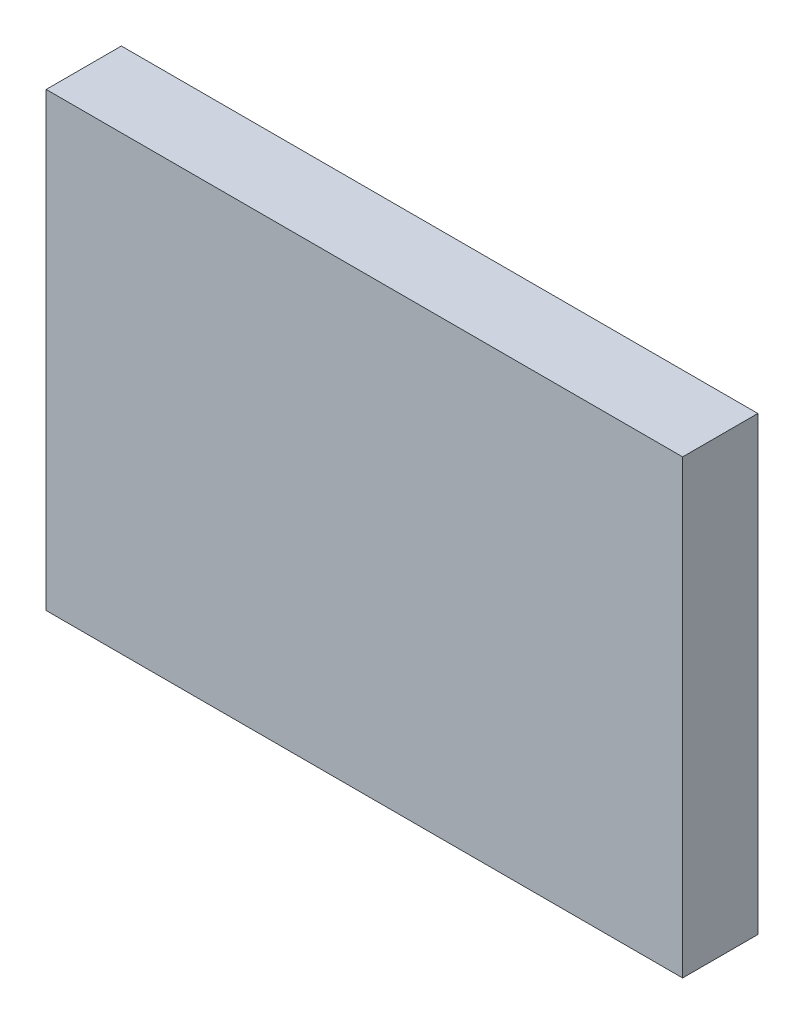
ISO-10303-21;
HEADER;
FILE_DESCRIPTION(('STEP AP214'),'2;1');
FILE_NAME('part.step','',(''),(''),'','','');
FILE_SCHEMA(('AUTOMOTIVE_DESIGN { 1 0 10303 214 1 1 1 1 }'));
ENDSEC;
DATA;
#1=APPLICATION_CONTEXT('core data for automotive mechanical design processes');
#2=APPLICATION_PROTOCOL_DEFINITION('international standard','automotive_design',2000,#1);
#3=PRODUCT_CONTEXT('',#1,'mechanical');
#4=PRODUCT('Part','Part','',(#3));
#5=PRODUCT_RELATED_PRODUCT_CATEGORY('part','',(#4));
#6=PRODUCT_DEFINITION_FORMATION('','',#4);
#7=PRODUCT_DEFINITION_CONTEXT('part definition',#1,'design');
#8=PRODUCT_DEFINITION('design','',#6,#7);
#9=PRODUCT_DEFINITION_SHAPE('','',#8);
#10=(LENGTH_UNIT() NAMED_UNIT(*) SI_UNIT(.MILLI.,.METRE.));
#11=(NAMED_UNIT(*) PLANE_ANGLE_UNIT() SI_UNIT($,.RADIAN.));
#12=(NAMED_UNIT(*) SI_UNIT($,.STERADIAN.) SOLID_ANGLE_UNIT());
#13=UNCERTAINTY_MEASURE_WITH_UNIT(LENGTH_MEASURE(1.E-05),#10,'distance_accuracy_value','');
#14=(GEOMETRIC_REPRESENTATION_CONTEXT(3) GLOBAL_UNCERTAINTY_ASSIGNED_CONTEXT((#13)) GLOBAL_UNIT_ASSIGNED_CONTEXT((#10,
#11,#12)) REPRESENTATION_CONTEXT('',''));
#15=CARTESIAN_POINT('',(0.,0.,0.));
#16=DIRECTION('',(0.,0.,1.));
#17=DIRECTION('',(1.,0.,0.));
#18=AXIS2_PLACEMENT_3D('',#15,#16,#17);
#19=CARTESIAN_POINT('',(0.,0.,13.));
#20=DIRECTION('',(1.,0.,0.));
#21=DIRECTION('',(0.,0.,-1.));
#22=AXIS2_PLACEMENT_3D('',#19,#20,#21);
#23=PLANE('',#22);
#24=DIRECTION('',(0.,-1.,0.));
#25=VECTOR('',#24,1.);
#26=CARTESIAN_POINT('',(0.,0.,0.));
#27=LINE('',#26,#25);
#28=CARTESIAN_POINT('',(0.,78.,0.));
#29=VERTEX_POINT('',#28);
#30=CARTESIAN_POINT('',(0.,0.,0.));
#31=VERTEX_POINT('',#30);
#32=EDGE_CURVE('E95',#29,#31,#27,.T.);
#33=ORIENTED_EDGE('',*,*,#32,.T.);
#34=DIRECTION('',(0.,0.,-1.));
#35=VECTOR('',#34,1.);
#36=CARTESIAN_POINT('',(0.,0.,13.));
#37=LINE('',#36,#35);
#38=CARTESIAN_POINT('',(0.,0.,13.));
#39=VERTEX_POINT('',#38);
#40=EDGE_CURVE('E11',#39,#31,#37,.T.);
#41=ORIENTED_EDGE('',*,*,#40,.F.);
#42=DIRECTION('',(0.,-1.,0.));
#43=VECTOR('',#42,1.);
#44=CARTESIAN_POINT('',(0.,0.,13.));
#45=LINE('',#44,#43);
#46=CARTESIAN_POINT('',(0.,78.,13.));
#47=VERTEX_POINT('',#46);
#48=EDGE_CURVE('E83',#47,#39,#45,.T.);
#49=ORIENTED_EDGE('',*,*,#48,.F.);
#50=DIRECTION('',(0.,0.,-1.));
#51=VECTOR('',#50,1.);
#52=CARTESIAN_POINT('',(0.,78.,13.));
#53=LINE('',#52,#51);
#54=EDGE_CURVE('E91',#47,#29,#53,.T.);
#55=ORIENTED_EDGE('',*,*,#54,.T.);
#56=EDGE_LOOP('',(#33,#41,#49,#55));
#57=FACE_BOUND('',#56,.T.);
#58=ADVANCED_FACE('F32',(#57),#23,.F.);
#59=CARTESIAN_POINT('',(0.,0.,13.));
#60=DIRECTION('',(0.,1.,0.));
#61=DIRECTION('',(0.,0.,1.));
#62=AXIS2_PLACEMENT_3D('',#59,#60,#61);
#63=PLANE('',#62);
#64=DIRECTION('',(1.,0.,0.));
#65=VECTOR('',#64,1.);
#66=CARTESIAN_POINT('',(0.,0.,0.));
#67=LINE('',#66,#65);
#68=CARTESIAN_POINT('',(110.,0.,0.));
#69=VERTEX_POINT('',#68);
#70=EDGE_CURVE('E87',#31,#69,#67,.T.);
#71=ORIENTED_EDGE('',*,*,#70,.T.);
#72=DIRECTION('',(0.,0.,-1.));
#73=VECTOR('',#72,1.);
#74=CARTESIAN_POINT('',(110.,0.,13.));
#75=LINE('',#74,#73);
#76=CARTESIAN_POINT('',(110.,0.,13.));
#77=VERTEX_POINT('',#76);
#78=EDGE_CURVE('E40',#77,#69,#75,.T.);
#79=ORIENTED_EDGE('',*,*,#78,.F.);
#80=DIRECTION('',(1.,0.,0.));
#81=VECTOR('',#80,1.);
#82=CARTESIAN_POINT('',(0.,0.,13.));
#83=LINE('',#82,#81);
#84=EDGE_CURVE('E78',#39,#77,#83,.T.);
#85=ORIENTED_EDGE('',*,*,#84,.F.);
#86=ORIENTED_EDGE('',*,*,#40,.T.);
#87=EDGE_LOOP('',(#71,#79,#85,#86));
#88=FACE_BOUND('',#87,.T.);
#89=ADVANCED_FACE('F86',(#88),#63,.F.);
#90=CARTESIAN_POINT('',(110.,0.,13.));
#91=DIRECTION('',(-1.,0.,0.));
#92=DIRECTION('',(0.,0.,1.));
#93=AXIS2_PLACEMENT_3D('',#90,#91,#92);
#94=PLANE('',#93);
#95=DIRECTION('',(0.,1.,0.));
#96=VECTOR('',#95,1.);
#97=CARTESIAN_POINT('',(110.,0.,0.));
#98=LINE('',#97,#96);
#99=CARTESIAN_POINT('',(110.,78.,0.));
#100=VERTEX_POINT('',#99);
#101=EDGE_CURVE('E65',#69,#100,#98,.T.);
#102=ORIENTED_EDGE('',*,*,#101,.T.);
#103=DIRECTION('',(0.,0.,-1.));
#104=VECTOR('',#103,1.);
#105=CARTESIAN_POINT('',(110.,78.,13.));
#106=LINE('',#105,#104);
#107=CARTESIAN_POINT('',(110.,78.,13.));
#108=VERTEX_POINT('',#107);
#109=EDGE_CURVE('E88',#108,#100,#106,.T.);
#110=ORIENTED_EDGE('',*,*,#109,.F.);
#111=DIRECTION('',(0.,1.,0.));
#112=VECTOR('',#111,1.);
#113=CARTESIAN_POINT('',(110.,0.,13.));
#114=LINE('',#113,#112);
#115=EDGE_CURVE('E81',#77,#108,#114,.T.);
#116=ORIENTED_EDGE('',*,*,#115,.F.);
#117=ORIENTED_EDGE('',*,*,#78,.T.);
#118=EDGE_LOOP('',(#102,#110,#116,#117));
#119=FACE_BOUND('',#118,.T.);
#120=ADVANCED_FACE('F89',(#119),#94,.F.);
#121=CARTESIAN_POINT('',(0.,78.,13.));
#122=DIRECTION('',(0.,-1.,0.));
#123=DIRECTION('',(0.,0.,-1.));
#124=AXIS2_PLACEMENT_3D('',#121,#122,#123);
#125=PLANE('',#124);
#126=DIRECTION('',(-1.,0.,0.));
#127=VECTOR('',#126,1.);
#128=CARTESIAN_POINT('',(0.,78.,0.));
#129=LINE('',#128,#127);
#130=EDGE_CURVE('E71',#100,#29,#129,.T.);
#131=ORIENTED_EDGE('',*,*,#130,.T.);
#132=ORIENTED_EDGE('',*,*,#54,.F.);
#133=DIRECTION('',(-1.,0.,0.));
#134=VECTOR('',#133,1.);
#135=CARTESIAN_POINT('',(0.,78.,13.));
#136=LINE('',#135,#134);
#137=EDGE_CURVE('E48',#108,#47,#136,.T.);
#138=ORIENTED_EDGE('',*,*,#137,.F.);
#139=ORIENTED_EDGE('',*,*,#109,.T.);
#140=EDGE_LOOP('',(#131,#132,#138,#139));
#141=FACE_BOUND('',#140,.T.);
#142=ADVANCED_FACE('F102',(#141),#125,.F.);
#143=CARTESIAN_POINT('',(0.,0.,13.));
#144=DIRECTION('',(0.,0.,-1.));
#145=DIRECTION('',(-1.,0.,0.));
#146=AXIS2_PLACEMENT_3D('',#143,#144,#145);
#147=PLANE('',#146);
#148=ORIENTED_EDGE('',*,*,#48,.T.);
#149=ORIENTED_EDGE('',*,*,#84,.T.);
#150=ORIENTED_EDGE('',*,*,#115,.T.);
#151=ORIENTED_EDGE('',*,*,#137,.T.);
#152=EDGE_LOOP('',(#148,#149,#150,#151));
#153=FACE_BOUND('',#152,.T.);
#154=ADVANCED_FACE('F79',(#153),#147,.F.);
#155=CARTESIAN_POINT('',(0.,0.,0.));
#156=DIRECTION('',(0.,0.,-1.));
#157=DIRECTION('',(-1.,0.,0.));
#158=AXIS2_PLACEMENT_3D('',#155,#156,#157);
#159=PLANE('',#158);
#160=ORIENTED_EDGE('',*,*,#32,.F.);
#161=ORIENTED_EDGE('',*,*,#130,.F.);
#162=ORIENTED_EDGE('',*,*,#101,.F.);
#163=ORIENTED_EDGE('',*,*,#70,.F.);
#164=EDGE_LOOP('',(#160,#161,#162,#163));
#165=FACE_BOUND('',#164,.T.);
#166=ADVANCED_FACE('F105',(#165),#159,.T.);
#167=CLOSED_SHELL('',(#58,#89,#120,#142,#154,#166));
#168=MANIFOLD_SOLID_BREP('B2',#167);
#169=ADVANCED_BREP_SHAPE_REPRESENTATION('',(#18,#168),#14);
#170=SHAPE_DEFINITION_REPRESENTATION(#9,#169);
ENDSEC;
END-ISO-10303-21;
